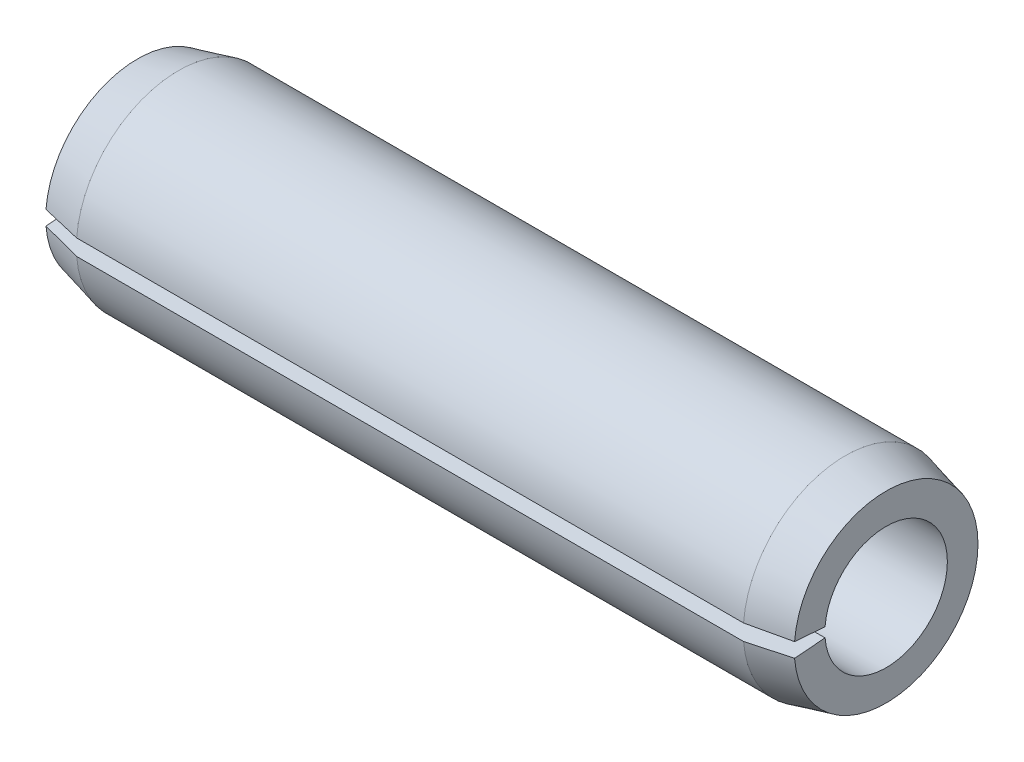
ISO-10303-21;
HEADER;
FILE_DESCRIPTION(('STEP AP214'),'2;1');
FILE_NAME('part.step','',(''),(''),'','','');
FILE_SCHEMA(('AUTOMOTIVE_DESIGN { 1 0 10303 214 1 1 1 1 }'));
ENDSEC;
DATA;
#1=APPLICATION_CONTEXT('core data for automotive mechanical design processes');
#2=APPLICATION_PROTOCOL_DEFINITION('international standard','automotive_design',2000,#1);
#3=PRODUCT_CONTEXT('',#1,'mechanical');
#4=PRODUCT('Part','Part','',(#3));
#5=PRODUCT_RELATED_PRODUCT_CATEGORY('part','',(#4));
#6=PRODUCT_DEFINITION_FORMATION('','',#4);
#7=PRODUCT_DEFINITION_CONTEXT('part definition',#1,'design');
#8=PRODUCT_DEFINITION('design','',#6,#7);
#9=PRODUCT_DEFINITION_SHAPE('','',#8);
#10=(LENGTH_UNIT() NAMED_UNIT(*) SI_UNIT(.MILLI.,.METRE.));
#11=(NAMED_UNIT(*) PLANE_ANGLE_UNIT() SI_UNIT($,.RADIAN.));
#12=(NAMED_UNIT(*) SI_UNIT($,.STERADIAN.) SOLID_ANGLE_UNIT());
#13=UNCERTAINTY_MEASURE_WITH_UNIT(LENGTH_MEASURE(1.E-05),#10,'distance_accuracy_value','');
#14=(GEOMETRIC_REPRESENTATION_CONTEXT(3) GLOBAL_UNCERTAINTY_ASSIGNED_CONTEXT((#13)) GLOBAL_UNIT_ASSIGNED_CONTEXT((#10,
#11,#12)) REPRESENTATION_CONTEXT('',''));
#15=CARTESIAN_POINT('',(0.,0.,0.));
#16=DIRECTION('',(0.,0.,1.));
#17=DIRECTION('',(1.,0.,0.));
#18=AXIS2_PLACEMENT_3D('',#15,#16,#17);
#19=CARTESIAN_POINT('',(0.,2.7,0.));
#20=DIRECTION('',(1.,0.,0.));
#21=DIRECTION('',(0.,0.,-1.));
#22=AXIS2_PLACEMENT_3D('',#19,#20,#21);
#23=PLANE('',#22);
#24=DIRECTION('',(0.,0.0784590957278456,0.996917333733128));
#25=VECTOR('',#24,1.);
#26=CARTESIAN_POINT('',(0.,0.,0.));
#27=LINE('',#26,#25);
#28=CARTESIAN_POINT('',(0.,0.141226372310122,1.79445120071963));
#29=VERTEX_POINT('',#28);
#30=CARTESIAN_POINT('',(0.,0.211839558465183,2.69167680107945));
#31=VERTEX_POINT('',#30);
#32=EDGE_CURVE('E88',#29,#31,#27,.T.);
#33=ORIENTED_EDGE('',*,*,#32,.T.);
#34=CARTESIAN_POINT('',(0.,0.,0.));
#35=DIRECTION('',(-1.,0.,0.));
#36=DIRECTION('',(0.,0.,1.));
#37=AXIS2_PLACEMENT_3D('',#34,#35,#36);
#38=CIRCLE('',#37,2.7);
#39=CARTESIAN_POINT('',(0.,-0.211839558465183,2.69167680107945));
#40=VERTEX_POINT('',#39);
#41=EDGE_CURVE('E106',#31,#40,#38,.T.);
#42=ORIENTED_EDGE('',*,*,#41,.T.);
#43=DIRECTION('',(0.,-0.0784590957278456,0.996917333733128));
#44=VECTOR('',#43,1.);
#45=CARTESIAN_POINT('',(0.,0.,0.));
#46=LINE('',#45,#44);
#47=CARTESIAN_POINT('',(0.,-0.141226372310122,1.79445120071963));
#48=VERTEX_POINT('',#47);
#49=EDGE_CURVE('E60',#48,#40,#46,.T.);
#50=ORIENTED_EDGE('',*,*,#49,.F.);
#51=CARTESIAN_POINT('',(0.,0.,0.));
#52=DIRECTION('',(-1.,0.,0.));
#53=DIRECTION('',(0.,0.,1.));
#54=AXIS2_PLACEMENT_3D('',#51,#52,#53);
#55=CIRCLE('',#54,1.8);
#56=EDGE_CURVE('E103',#29,#48,#55,.T.);
#57=ORIENTED_EDGE('',*,*,#56,.F.);
#58=EDGE_LOOP('',(#33,#42,#50,#57));
#59=FACE_BOUND('',#58,.T.);
#60=ADVANCED_FACE('F39',(#59),#23,.F.);
#61=CARTESIAN_POINT('',(-9.52499999999999,0.,0.));
#62=DIRECTION('',(-1.,0.,0.));
#63=DIRECTION('',(0.,0.,1.));
#64=AXIS2_PLACEMENT_3D('',#61,#62,#63);
#65=CYLINDRICAL_SURFACE('',#64,1.8);
#66=DIRECTION('',(-1.,0.,0.));
#67=VECTOR('',#66,1.);
#68=CARTESIAN_POINT('',(-9.52499999999999,0.141226372310122,1.79445120071963));
#69=LINE('',#68,#67);
#70=CARTESIAN_POINT('',(22.,0.141226372310122,1.79445120071963));
#71=VERTEX_POINT('',#70);
#72=EDGE_CURVE('E91',#29,#71,#69,.F.);
#73=ORIENTED_EDGE('',*,*,#72,.F.);
#74=ORIENTED_EDGE('',*,*,#56,.T.);
#75=DIRECTION('',(-1.,0.,0.));
#76=VECTOR('',#75,1.);
#77=CARTESIAN_POINT('',(-9.52499999999999,-0.141226372310122,1.79445120071963));
#78=LINE('',#77,#76);
#79=CARTESIAN_POINT('',(22.,-0.141226372310122,1.79445120071963));
#80=VERTEX_POINT('',#79);
#81=EDGE_CURVE('E124',#48,#80,#78,.F.);
#82=ORIENTED_EDGE('',*,*,#81,.T.);
#83=CARTESIAN_POINT('',(22.,0.,0.));
#84=DIRECTION('',(-1.,0.,0.));
#85=DIRECTION('',(0.,0.,1.));
#86=AXIS2_PLACEMENT_3D('',#83,#84,#85);
#87=CIRCLE('',#86,1.8);
#88=EDGE_CURVE('E105',#71,#80,#87,.T.);
#89=ORIENTED_EDGE('',*,*,#88,.F.);
#90=EDGE_LOOP('',(#73,#74,#82,#89));
#91=FACE_BOUND('',#90,.T.);
#92=ADVANCED_FACE('F101',(#91),#65,.F.);
#93=CARTESIAN_POINT('',(22.,1.8,0.));
#94=DIRECTION('',(-1.,0.,0.));
#95=DIRECTION('',(0.,0.,1.));
#96=AXIS2_PLACEMENT_3D('',#93,#94,#95);
#97=PLANE('',#96);
#98=DIRECTION('',(0.,0.0784590957278456,0.996917333733128));
#99=VECTOR('',#98,1.);
#100=CARTESIAN_POINT('',(22.,0.,0.));
#101=LINE('',#100,#99);
#102=CARTESIAN_POINT('',(22.,0.211839558465183,2.69167680107945));
#103=VERTEX_POINT('',#102);
#104=EDGE_CURVE('E133',#71,#103,#101,.T.);
#105=ORIENTED_EDGE('',*,*,#104,.F.);
#106=ORIENTED_EDGE('',*,*,#88,.T.);
#107=DIRECTION('',(0.,-0.0784590957278456,0.996917333733128));
#108=VECTOR('',#107,1.);
#109=CARTESIAN_POINT('',(22.,0.,0.));
#110=LINE('',#109,#108);
#111=CARTESIAN_POINT('',(22.,-0.211839558465183,2.69167680107945));
#112=VERTEX_POINT('',#111);
#113=EDGE_CURVE('E132',#80,#112,#110,.T.);
#114=ORIENTED_EDGE('',*,*,#113,.T.);
#115=CARTESIAN_POINT('',(22.,0.,0.));
#116=DIRECTION('',(-1.,0.,0.));
#117=DIRECTION('',(0.,0.,1.));
#118=AXIS2_PLACEMENT_3D('',#115,#116,#117);
#119=CIRCLE('',#118,2.7);
#120=EDGE_CURVE('E110',#103,#112,#119,.T.);
#121=ORIENTED_EDGE('',*,*,#120,.F.);
#122=EDGE_LOOP('',(#105,#106,#114,#121));
#123=FACE_BOUND('',#122,.T.);
#124=ADVANCED_FACE('F143',(#123),#97,.F.);
#125=CARTESIAN_POINT('',(22.,0.,0.));
#126=DIRECTION('',(-1.,0.,0.));
#127=DIRECTION('',(0.,0.,1.));
#128=AXIS2_PLACEMENT_3D('',#125,#126,#127);
#129=CONICAL_SURFACE('',#128,2.7,0.244978663126866);
#130=DIRECTION('',(-0.970142500145332,0.0190291258221386,0.24178796864652));
#131=VECTOR('',#130,1.);
#132=CARTESIAN_POINT('',(32.7999999999999,0.,0.));
#133=LINE('',#132,#131);
#134=CARTESIAN_POINT('',(20.8,0.235377287183537,2.99075200119939));
#135=VERTEX_POINT('',#134);
#136=EDGE_CURVE('E107',#103,#135,#133,.T.);
#137=ORIENTED_EDGE('',*,*,#136,.F.);
#138=ORIENTED_EDGE('',*,*,#120,.T.);
#139=DIRECTION('',(-0.970142500145332,-0.0190291258221386,0.24178796864652));
#140=VECTOR('',#139,1.);
#141=CARTESIAN_POINT('',(32.7999999999999,0.,0.));
#142=LINE('',#141,#140);
#143=CARTESIAN_POINT('',(20.8,-0.235377287183537,2.99075200119939));
#144=VERTEX_POINT('',#143);
#145=EDGE_CURVE('E126',#112,#144,#142,.T.);
#146=ORIENTED_EDGE('',*,*,#145,.T.);
#147=CARTESIAN_POINT('',(20.8,0.,0.));
#148=DIRECTION('',(-1.,0.,0.));
#149=DIRECTION('',(0.,0.,1.));
#150=AXIS2_PLACEMENT_3D('',#147,#148,#149);
#151=CIRCLE('',#150,3.);
#152=EDGE_CURVE('E115',#135,#144,#151,.T.);
#153=ORIENTED_EDGE('',*,*,#152,.F.);
#154=EDGE_LOOP('',(#137,#138,#146,#153));
#155=FACE_BOUND('',#154,.T.);
#156=ADVANCED_FACE('F142',(#155),#129,.T.);
#157=CARTESIAN_POINT('',(-9.52499999999999,0.,0.));
#158=DIRECTION('',(-1.,0.,0.));
#159=DIRECTION('',(0.,0.,1.));
#160=AXIS2_PLACEMENT_3D('',#157,#158,#159);
#161=CYLINDRICAL_SURFACE('',#160,3.);
#162=DIRECTION('',(-1.,0.,0.));
#163=VECTOR('',#162,1.);
#164=CARTESIAN_POINT('',(-9.52499999999999,0.235377287183537,2.99075200119939));
#165=LINE('',#164,#163);
#166=CARTESIAN_POINT('',(1.2,0.235377287183537,2.99075200119938));
#167=VERTEX_POINT('',#166);
#168=EDGE_CURVE('E52',#135,#167,#165,.T.);
#169=ORIENTED_EDGE('',*,*,#168,.F.);
#170=ORIENTED_EDGE('',*,*,#152,.T.);
#171=DIRECTION('',(-1.,0.,0.));
#172=VECTOR('',#171,1.);
#173=CARTESIAN_POINT('',(-9.52499999999999,-0.235377287183537,2.99075200119939));
#174=LINE('',#173,#172);
#175=CARTESIAN_POINT('',(1.2,-0.235377287183537,2.99075200119938));
#176=VERTEX_POINT('',#175);
#177=EDGE_CURVE('E129',#144,#176,#174,.T.);
#178=ORIENTED_EDGE('',*,*,#177,.T.);
#179=CARTESIAN_POINT('',(1.2,0.,0.));
#180=DIRECTION('',(-1.,0.,0.));
#181=DIRECTION('',(0.,0.,1.));
#182=AXIS2_PLACEMENT_3D('',#179,#180,#181);
#183=CIRCLE('',#182,3.);
#184=EDGE_CURVE('E118',#167,#176,#183,.T.);
#185=ORIENTED_EDGE('',*,*,#184,.F.);
#186=EDGE_LOOP('',(#169,#170,#178,#185));
#187=FACE_BOUND('',#186,.T.);
#188=ADVANCED_FACE('F146',(#187),#161,.T.);
#189=CARTESIAN_POINT('',(1.2,0.,0.));
#190=DIRECTION('',(1.,0.,0.));
#191=DIRECTION('',(0.,0.,-1.));
#192=AXIS2_PLACEMENT_3D('',#189,#190,#191);
#193=CONICAL_SURFACE('',#192,3.,0.244978663126864);
#194=DIRECTION('',(-0.970142500145332,-0.0190291258221385,-0.241787968646519));
#195=VECTOR('',#194,1.);
#196=CARTESIAN_POINT('',(-10.8,0.,0.));
#197=LINE('',#196,#195);
#198=EDGE_CURVE('E11',#167,#31,#197,.T.);
#199=ORIENTED_EDGE('',*,*,#198,.F.);
#200=ORIENTED_EDGE('',*,*,#184,.T.);
#201=DIRECTION('',(-0.970142500145332,0.0190291258221385,-0.241787968646519));
#202=VECTOR('',#201,1.);
#203=CARTESIAN_POINT('',(-10.8,0.,0.));
#204=LINE('',#203,#202);
#205=EDGE_CURVE('E46',#176,#40,#204,.T.);
#206=ORIENTED_EDGE('',*,*,#205,.T.);
#207=ORIENTED_EDGE('',*,*,#41,.F.);
#208=EDGE_LOOP('',(#199,#200,#206,#207));
#209=FACE_BOUND('',#208,.T.);
#210=ADVANCED_FACE('F149',(#209),#193,.T.);
#211=CARTESIAN_POINT('',(22.,0.,0.));
#212=DIRECTION('',(0.,-0.996917333733128,-0.0784590957278456));
#213=DIRECTION('',(0.,0.0784590957278456,-0.996917333733128));
#214=AXIS2_PLACEMENT_3D('',#211,#212,#213);
#215=PLANE('',#214);
#216=ORIENTED_EDGE('',*,*,#49,.T.);
#217=ORIENTED_EDGE('',*,*,#205,.F.);
#218=ORIENTED_EDGE('',*,*,#177,.F.);
#219=ORIENTED_EDGE('',*,*,#145,.F.);
#220=ORIENTED_EDGE('',*,*,#113,.F.);
#221=ORIENTED_EDGE('',*,*,#81,.F.);
#222=EDGE_LOOP('',(#216,#217,#218,#219,#220,#221));
#223=FACE_BOUND('',#222,.T.);
#224=ADVANCED_FACE('F144',(#223),#215,.F.);
#225=CARTESIAN_POINT('',(22.,0.,0.));
#226=DIRECTION('',(0.,-0.996917333733128,0.0784590957278456));
#227=DIRECTION('',(0.,-0.0784590957278456,-0.996917333733128));
#228=AXIS2_PLACEMENT_3D('',#225,#226,#227);
#229=PLANE('',#228);
#230=ORIENTED_EDGE('',*,*,#72,.T.);
#231=ORIENTED_EDGE('',*,*,#104,.T.);
#232=ORIENTED_EDGE('',*,*,#136,.T.);
#233=ORIENTED_EDGE('',*,*,#168,.T.);
#234=ORIENTED_EDGE('',*,*,#198,.T.);
#235=ORIENTED_EDGE('',*,*,#32,.F.);
#236=EDGE_LOOP('',(#230,#231,#232,#233,#234,#235));
#237=FACE_BOUND('',#236,.T.);
#238=ADVANCED_FACE('F90',(#237),#229,.T.);
#239=CLOSED_SHELL('',(#60,#92,#124,#156,#188,#210,#224,#238));
#240=MANIFOLD_SOLID_BREP('B2',#239);
#241=ADVANCED_BREP_SHAPE_REPRESENTATION('',(#18,#240),#14);
#242=SHAPE_DEFINITION_REPRESENTATION(#9,#241);
ENDSEC;
END-ISO-10303-21;
